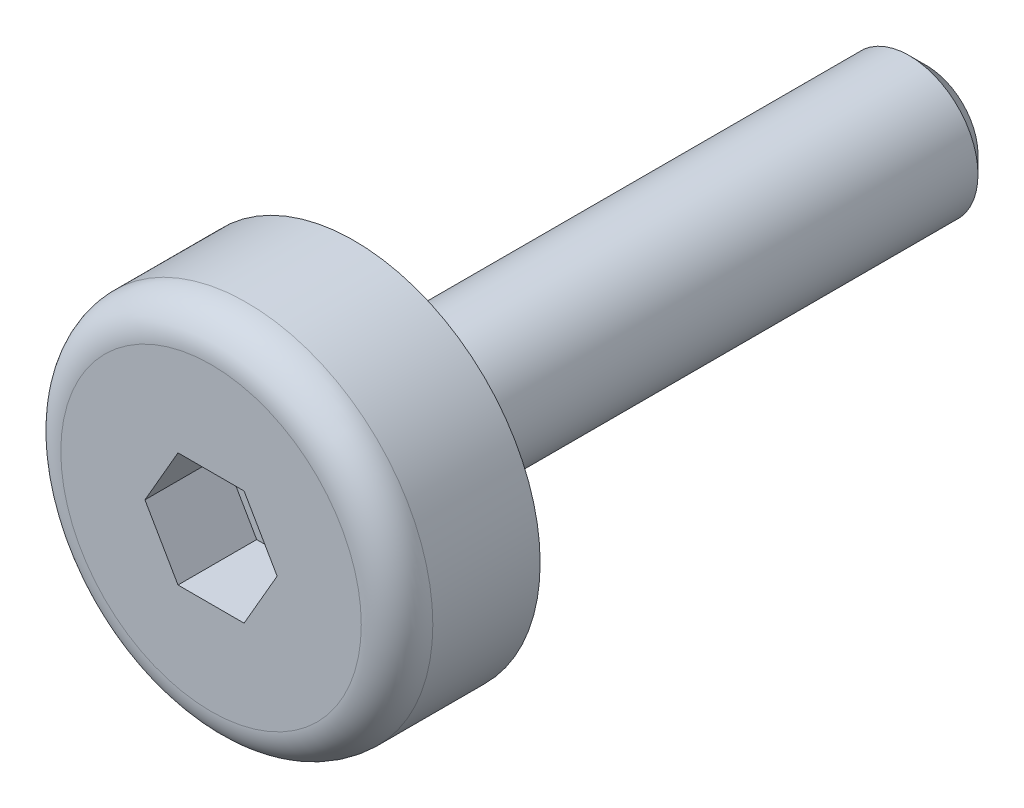
ISO-10303-21;
HEADER;
FILE_DESCRIPTION(('STEP AP214'),'2;1');
FILE_NAME('part.step','',(''),(''),'','','');
FILE_SCHEMA(('AUTOMOTIVE_DESIGN { 1 0 10303 214 1 1 1 1 }'));
ENDSEC;
DATA;
#1=APPLICATION_CONTEXT('core data for automotive mechanical design processes');
#2=APPLICATION_PROTOCOL_DEFINITION('international standard','automotive_design',2000,#1);
#3=PRODUCT_CONTEXT('',#1,'mechanical');
#4=PRODUCT('Part','Part','',(#3));
#5=PRODUCT_RELATED_PRODUCT_CATEGORY('part','',(#4));
#6=PRODUCT_DEFINITION_FORMATION('','',#4);
#7=PRODUCT_DEFINITION_CONTEXT('part definition',#1,'design');
#8=PRODUCT_DEFINITION('design','',#6,#7);
#9=PRODUCT_DEFINITION_SHAPE('','',#8);
#10=(LENGTH_UNIT() NAMED_UNIT(*) SI_UNIT(.MILLI.,.METRE.));
#11=(NAMED_UNIT(*) PLANE_ANGLE_UNIT() SI_UNIT($,.RADIAN.));
#12=(NAMED_UNIT(*) SI_UNIT($,.STERADIAN.) SOLID_ANGLE_UNIT());
#13=UNCERTAINTY_MEASURE_WITH_UNIT(LENGTH_MEASURE(1.E-05),#10,'distance_accuracy_value','');
#14=(GEOMETRIC_REPRESENTATION_CONTEXT(3) GLOBAL_UNCERTAINTY_ASSIGNED_CONTEXT((#13)) GLOBAL_UNIT_ASSIGNED_CONTEXT((#10,
#11,#12)) REPRESENTATION_CONTEXT('',''));
#15=CARTESIAN_POINT('',(0.,0.,0.));
#16=DIRECTION('',(0.,0.,1.));
#17=DIRECTION('',(1.,0.,0.));
#18=AXIS2_PLACEMENT_3D('',#15,#16,#17);
#19=CARTESIAN_POINT('',(0.,0.,-10.));
#20=DIRECTION('',(0.,0.,-1.));
#21=DIRECTION('',(-1.,0.,0.));
#22=AXIS2_PLACEMENT_3D('',#19,#20,#21);
#23=PLANE('',#22);
#24=CARTESIAN_POINT('',(0.,0.,-10.));
#25=DIRECTION('',(0.,0.,-1.));
#26=DIRECTION('',(-1.,0.,0.));
#27=AXIS2_PLACEMENT_3D('',#24,#25,#26);
#28=CIRCLE('',#27,0.900000000000001);
#29=CARTESIAN_POINT('',(-0.900000000000001,0.,-10.));
#30=VERTEX_POINT('',#29);
#31=EDGE_CURVE('E156',#30,#30,#28,.T.);
#32=ORIENTED_EDGE('',*,*,#31,.T.);
#33=EDGE_LOOP('',(#32));
#34=FACE_BOUND('',#33,.T.);
#35=ADVANCED_FACE('F40',(#34),#23,.T.);
#36=CARTESIAN_POINT('',(0.,0.,10.123));
#37=DIRECTION('',(0.,0.,1.));
#38=DIRECTION('',(1.,0.,0.));
#39=AXIS2_PLACEMENT_3D('',#36,#37,#38);
#40=CYLINDRICAL_SURFACE('',#39,1.2);
#41=CARTESIAN_POINT('',(0.,0.,-9.7));
#42=DIRECTION('',(0.,0.,-1.));
#43=DIRECTION('',(-1.,0.,0.));
#44=AXIS2_PLACEMENT_3D('',#41,#42,#43);
#45=CIRCLE('',#44,1.2);
#46=CARTESIAN_POINT('',(-1.2,0.,-9.7));
#47=VERTEX_POINT('',#46);
#48=EDGE_CURVE('E153',#47,#47,#45,.F.);
#49=ORIENTED_EDGE('',*,*,#48,.T.);
#50=EDGE_LOOP('',(#49));
#51=FACE_BOUND('',#50,.T.);
#52=CARTESIAN_POINT('',(0.,0.,0.));
#53=DIRECTION('',(0.,0.,1.));
#54=DIRECTION('',(1.,0.,0.));
#55=AXIS2_PLACEMENT_3D('',#52,#53,#54);
#56=CIRCLE('',#55,1.2);
#57=CARTESIAN_POINT('',(1.2,0.,0.));
#58=VERTEX_POINT('',#57);
#59=EDGE_CURVE('E150',#58,#58,#56,.T.);
#60=ORIENTED_EDGE('',*,*,#59,.F.);
#61=EDGE_LOOP('',(#60));
#62=FACE_BOUND('',#61,.T.);
#63=ADVANCED_FACE('F176',(#51,#62),#40,.T.);
#64=CARTESIAN_POINT('',(1.2,0.,0.));
#65=DIRECTION('',(0.,0.,-1.));
#66=DIRECTION('',(-1.,0.,0.));
#67=AXIS2_PLACEMENT_3D('',#64,#65,#66);
#68=PLANE('',#67);
#69=ORIENTED_EDGE('',*,*,#59,.T.);
#70=EDGE_LOOP('',(#69));
#71=FACE_BOUND('',#70,.T.);
#72=CARTESIAN_POINT('',(0.,0.,0.));
#73=DIRECTION('',(0.,0.,1.));
#74=DIRECTION('',(1.,0.,0.));
#75=AXIS2_PLACEMENT_3D('',#72,#73,#74);
#76=CIRCLE('',#75,3.25);
#77=CARTESIAN_POINT('',(3.25,0.,0.));
#78=VERTEX_POINT('',#77);
#79=EDGE_CURVE('E142',#78,#78,#76,.T.);
#80=ORIENTED_EDGE('',*,*,#79,.F.);
#81=EDGE_LOOP('',(#80));
#82=FACE_BOUND('',#81,.T.);
#83=ADVANCED_FACE('F182',(#71,#82),#68,.T.);
#84=CARTESIAN_POINT('',(0.,0.,10.123));
#85=DIRECTION('',(0.,0.,1.));
#86=DIRECTION('',(1.,0.,0.));
#87=AXIS2_PLACEMENT_3D('',#84,#85,#86);
#88=CYLINDRICAL_SURFACE('',#87,3.25);
#89=CARTESIAN_POINT('',(0.,0.,1.875));
#90=DIRECTION('',(0.,0.,1.));
#91=DIRECTION('',(1.,0.,0.));
#92=AXIS2_PLACEMENT_3D('',#89,#90,#91);
#93=CIRCLE('',#92,3.25);
#94=CARTESIAN_POINT('',(3.25,0.,1.875));
#95=VERTEX_POINT('',#94);
#96=EDGE_CURVE('E11',#95,#95,#93,.F.);
#97=ORIENTED_EDGE('',*,*,#96,.T.);
#98=EDGE_LOOP('',(#97));
#99=FACE_BOUND('',#98,.T.);
#100=ORIENTED_EDGE('',*,*,#79,.T.);
#101=EDGE_LOOP('',(#100));
#102=FACE_BOUND('',#101,.T.);
#103=ADVANCED_FACE('F191',(#99,#102),#88,.T.);
#104=CARTESIAN_POINT('',(3.25,0.,2.5));
#105=DIRECTION('',(0.,0.,1.));
#106=DIRECTION('',(1.,0.,0.));
#107=AXIS2_PLACEMENT_3D('',#104,#105,#106);
#108=PLANE('',#107);
#109=DIRECTION('',(0.499999999999995,0.866025403784441,0.));
#110=VECTOR('',#109,1.);
#111=CARTESIAN_POINT('',(0.577350269189637,-0.999999999999993,2.5));
#112=LINE('',#111,#110);
#113=CARTESIAN_POINT('',(0.577350269189637,-0.999999999999993,2.5));
#114=VERTEX_POINT('',#113);
#115=CARTESIAN_POINT('',(1.15470053837925,0.,2.5));
#116=VERTEX_POINT('',#115);
#117=EDGE_CURVE('E55',#114,#116,#112,.T.);
#118=ORIENTED_EDGE('',*,*,#117,.F.);
#119=DIRECTION('',(1.,0.,0.));
#120=VECTOR('',#119,1.);
#121=CARTESIAN_POINT('',(-0.577350269189617,-1.00000000000001,2.5));
#122=LINE('',#121,#120);
#123=CARTESIAN_POINT('',(-0.577350269189617,-1.00000000000001,2.5));
#124=VERTEX_POINT('',#123);
#125=EDGE_CURVE('E138',#124,#114,#122,.T.);
#126=ORIENTED_EDGE('',*,*,#125,.F.);
#127=DIRECTION('',(0.500000000000007,-0.866025403784434,0.));
#128=VECTOR('',#127,1.);
#129=CARTESIAN_POINT('',(-1.15470053837925,0.,2.5));
#130=LINE('',#129,#128);
#131=CARTESIAN_POINT('',(-1.15470053837925,0.,2.5));
#132=VERTEX_POINT('',#131);
#133=EDGE_CURVE('E136',#132,#124,#130,.T.);
#134=ORIENTED_EDGE('',*,*,#133,.F.);
#135=DIRECTION('',(-0.499999999999995,-0.866025403784442,0.));
#136=VECTOR('',#135,1.);
#137=CARTESIAN_POINT('',(-0.57735026918963,0.999999999999998,2.5));
#138=LINE('',#137,#136);
#139=CARTESIAN_POINT('',(-0.57735026918963,0.999999999999998,2.5));
#140=VERTEX_POINT('',#139);
#141=EDGE_CURVE('E103',#140,#132,#138,.T.);
#142=ORIENTED_EDGE('',*,*,#141,.F.);
#143=DIRECTION('',(-1.,0.,0.));
#144=VECTOR('',#143,1.);
#145=CARTESIAN_POINT('',(0.577350269189624,1.,2.5));
#146=LINE('',#145,#144);
#147=CARTESIAN_POINT('',(0.577350269189624,1.,2.5));
#148=VERTEX_POINT('',#147);
#149=EDGE_CURVE('E132',#148,#140,#146,.T.);
#150=ORIENTED_EDGE('',*,*,#149,.F.);
#151=DIRECTION('',(-0.500000000000001,0.866025403784438,0.));
#152=VECTOR('',#151,1.);
#153=CARTESIAN_POINT('',(1.15470053837925,0.,2.5));
#154=LINE('',#153,#152);
#155=EDGE_CURVE('E129',#116,#148,#154,.T.);
#156=ORIENTED_EDGE('',*,*,#155,.F.);
#157=EDGE_LOOP('',(#118,#126,#134,#142,#150,#156));
#158=FACE_BOUND('',#157,.T.);
#159=CARTESIAN_POINT('',(0.,0.,2.5));
#160=DIRECTION('',(0.,0.,1.));
#161=DIRECTION('',(1.,0.,0.));
#162=AXIS2_PLACEMENT_3D('',#159,#160,#161);
#163=CIRCLE('',#162,2.625);
#164=CARTESIAN_POINT('',(2.625,0.,2.5));
#165=VERTEX_POINT('',#164);
#166=EDGE_CURVE('E48',#165,#165,#163,.T.);
#167=ORIENTED_EDGE('',*,*,#166,.T.);
#168=EDGE_LOOP('',(#167));
#169=FACE_BOUND('',#168,.T.);
#170=ADVANCED_FACE('F161',(#158,#169),#108,.T.);
#171=CARTESIAN_POINT('',(0.,0.,-9.7));
#172=DIRECTION('',(0.,0.,1.));
#173=DIRECTION('',(1.,0.,0.));
#174=AXIS2_PLACEMENT_3D('',#171,#172,#173);
#175=CONICAL_SURFACE('',#174,1.2,0.785398163397446);
#176=ORIENTED_EDGE('',*,*,#31,.F.);
#177=EDGE_LOOP('',(#176));
#178=FACE_BOUND('',#177,.T.);
#179=ORIENTED_EDGE('',*,*,#48,.F.);
#180=EDGE_LOOP('',(#179));
#181=FACE_BOUND('',#180,.T.);
#182=ADVANCED_FACE('F165',(#178,#181),#175,.T.);
#183=CARTESIAN_POINT('',(0.,0.,1.875));
#184=DIRECTION('',(0.,0.,1.));
#185=DIRECTION('',(1.,0.,0.));
#186=AXIS2_PLACEMENT_3D('',#183,#184,#185);
#187=TOROIDAL_SURFACE('',#186,2.625,0.625);
#188=ORIENTED_EDGE('',*,*,#96,.F.);
#189=EDGE_LOOP('',(#188));
#190=FACE_BOUND('',#189,.T.);
#191=ORIENTED_EDGE('',*,*,#166,.F.);
#192=EDGE_LOOP('',(#191));
#193=FACE_BOUND('',#192,.T.);
#194=ADVANCED_FACE('F42',(#190,#193),#187,.T.);
#195=CARTESIAN_POINT('',(0.577350269189637,-0.999999999999993,1.125));
#196=DIRECTION('',(0.866025403784441,-0.499999999999995,0.));
#197=DIRECTION('',(0.499999999999995,0.866025403784441,0.));
#198=AXIS2_PLACEMENT_3D('',#195,#196,#197);
#199=PLANE('',#198);
#200=ORIENTED_EDGE('',*,*,#117,.T.);
#201=DIRECTION('',(0.,0.,1.));
#202=VECTOR('',#201,1.);
#203=CARTESIAN_POINT('',(1.15470053837925,0.,1.125));
#204=LINE('',#203,#202);
#205=CARTESIAN_POINT('',(1.15470053837925,0.,1.125));
#206=VERTEX_POINT('',#205);
#207=EDGE_CURVE('E85',#206,#116,#204,.T.);
#208=ORIENTED_EDGE('',*,*,#207,.F.);
#209=DIRECTION('',(0.499999999999995,0.866025403784441,0.));
#210=VECTOR('',#209,1.);
#211=CARTESIAN_POINT('',(0.577350269189637,-0.999999999999993,1.125));
#212=LINE('',#211,#210);
#213=CARTESIAN_POINT('',(0.577350269189637,-0.999999999999993,1.125));
#214=VERTEX_POINT('',#213);
#215=EDGE_CURVE('E140',#214,#206,#212,.T.);
#216=ORIENTED_EDGE('',*,*,#215,.F.);
#217=DIRECTION('',(0.,0.,1.));
#218=VECTOR('',#217,1.);
#219=CARTESIAN_POINT('',(0.577350269189637,-0.999999999999993,1.125));
#220=LINE('',#219,#218);
#221=EDGE_CURVE('E63',#214,#114,#220,.T.);
#222=ORIENTED_EDGE('',*,*,#221,.T.);
#223=EDGE_LOOP('',(#200,#208,#216,#222));
#224=FACE_BOUND('',#223,.T.);
#225=ADVANCED_FACE('F164',(#224),#199,.F.);
#226=CARTESIAN_POINT('',(-0.577350269189617,-1.00000000000001,1.125));
#227=DIRECTION('',(0.,-1.,0.));
#228=DIRECTION('',(1.,0.,0.));
#229=AXIS2_PLACEMENT_3D('',#226,#227,#228);
#230=PLANE('',#229);
#231=ORIENTED_EDGE('',*,*,#125,.T.);
#232=ORIENTED_EDGE('',*,*,#221,.F.);
#233=DIRECTION('',(1.,0.,0.));
#234=VECTOR('',#233,1.);
#235=CARTESIAN_POINT('',(-0.577350269189617,-1.00000000000001,1.125));
#236=LINE('',#235,#234);
#237=CARTESIAN_POINT('',(-0.577350269189617,-1.00000000000001,1.125));
#238=VERTEX_POINT('',#237);
#239=EDGE_CURVE('E115',#238,#214,#236,.T.);
#240=ORIENTED_EDGE('',*,*,#239,.F.);
#241=DIRECTION('',(0.,0.,1.));
#242=VECTOR('',#241,1.);
#243=CARTESIAN_POINT('',(-0.577350269189617,-1.00000000000001,1.125));
#244=LINE('',#243,#242);
#245=EDGE_CURVE('E107',#238,#124,#244,.T.);
#246=ORIENTED_EDGE('',*,*,#245,.T.);
#247=EDGE_LOOP('',(#231,#232,#240,#246));
#248=FACE_BOUND('',#247,.T.);
#249=ADVANCED_FACE('F171',(#248),#230,.F.);
#250=CARTESIAN_POINT('',(-1.15470053837925,0.,1.125));
#251=DIRECTION('',(-0.866025403784435,-0.500000000000007,0.));
#252=DIRECTION('',(0.500000000000007,-0.866025403784435,0.));
#253=AXIS2_PLACEMENT_3D('',#250,#251,#252);
#254=PLANE('',#253);
#255=ORIENTED_EDGE('',*,*,#133,.T.);
#256=ORIENTED_EDGE('',*,*,#245,.F.);
#257=DIRECTION('',(0.500000000000007,-0.866025403784434,0.));
#258=VECTOR('',#257,1.);
#259=CARTESIAN_POINT('',(-1.15470053837925,0.,1.125));
#260=LINE('',#259,#258);
#261=CARTESIAN_POINT('',(-1.15470053837925,0.,1.125));
#262=VERTEX_POINT('',#261);
#263=EDGE_CURVE('E111',#262,#238,#260,.T.);
#264=ORIENTED_EDGE('',*,*,#263,.F.);
#265=DIRECTION('',(0.,0.,1.));
#266=VECTOR('',#265,1.);
#267=CARTESIAN_POINT('',(-1.15470053837925,0.,1.125));
#268=LINE('',#267,#266);
#269=EDGE_CURVE('E96',#262,#132,#268,.T.);
#270=ORIENTED_EDGE('',*,*,#269,.T.);
#271=EDGE_LOOP('',(#255,#256,#264,#270));
#272=FACE_BOUND('',#271,.T.);
#273=ADVANCED_FACE('F112',(#272),#254,.F.);
#274=CARTESIAN_POINT('',(-0.57735026918963,0.999999999999998,1.125));
#275=DIRECTION('',(-0.866025403784442,0.499999999999995,0.));
#276=DIRECTION('',(-0.499999999999995,-0.866025403784441,0.));
#277=AXIS2_PLACEMENT_3D('',#274,#275,#276);
#278=PLANE('',#277);
#279=ORIENTED_EDGE('',*,*,#141,.T.);
#280=ORIENTED_EDGE('',*,*,#269,.F.);
#281=DIRECTION('',(-0.499999999999995,-0.866025403784442,0.));
#282=VECTOR('',#281,1.);
#283=CARTESIAN_POINT('',(-0.57735026918963,0.999999999999998,1.125));
#284=LINE('',#283,#282);
#285=CARTESIAN_POINT('',(-0.57735026918963,0.999999999999998,1.125));
#286=VERTEX_POINT('',#285);
#287=EDGE_CURVE('E100',#286,#262,#284,.T.);
#288=ORIENTED_EDGE('',*,*,#287,.F.);
#289=DIRECTION('',(0.,0.,1.));
#290=VECTOR('',#289,1.);
#291=CARTESIAN_POINT('',(-0.57735026918963,0.999999999999998,1.125));
#292=LINE('',#291,#290);
#293=EDGE_CURVE('E108',#286,#140,#292,.T.);
#294=ORIENTED_EDGE('',*,*,#293,.T.);
#295=EDGE_LOOP('',(#279,#280,#288,#294));
#296=FACE_BOUND('',#295,.T.);
#297=ADVANCED_FACE('F98',(#296),#278,.F.);
#298=CARTESIAN_POINT('',(0.577350269189624,1.,1.125));
#299=DIRECTION('',(0.,1.,0.));
#300=DIRECTION('',(-1.,0.,0.));
#301=AXIS2_PLACEMENT_3D('',#298,#299,#300);
#302=PLANE('',#301);
#303=ORIENTED_EDGE('',*,*,#149,.T.);
#304=ORIENTED_EDGE('',*,*,#293,.F.);
#305=DIRECTION('',(-1.,0.,0.));
#306=VECTOR('',#305,1.);
#307=CARTESIAN_POINT('',(0.577350269189624,1.,1.125));
#308=LINE('',#307,#306);
#309=CARTESIAN_POINT('',(0.577350269189624,1.,1.125));
#310=VERTEX_POINT('',#309);
#311=EDGE_CURVE('E121',#310,#286,#308,.T.);
#312=ORIENTED_EDGE('',*,*,#311,.F.);
#313=DIRECTION('',(0.,0.,1.));
#314=VECTOR('',#313,1.);
#315=CARTESIAN_POINT('',(0.577350269189624,1.,1.125));
#316=LINE('',#315,#314);
#317=EDGE_CURVE('E145',#310,#148,#316,.T.);
#318=ORIENTED_EDGE('',*,*,#317,.T.);
#319=EDGE_LOOP('',(#303,#304,#312,#318));
#320=FACE_BOUND('',#319,.T.);
#321=ADVANCED_FACE('F202',(#320),#302,.F.);
#322=CARTESIAN_POINT('',(1.15470053837925,0.,1.125));
#323=DIRECTION('',(0.866025403784438,0.500000000000001,0.));
#324=DIRECTION('',(-0.500000000000001,0.866025403784438,0.));
#325=AXIS2_PLACEMENT_3D('',#322,#323,#324);
#326=PLANE('',#325);
#327=ORIENTED_EDGE('',*,*,#155,.T.);
#328=ORIENTED_EDGE('',*,*,#317,.F.);
#329=DIRECTION('',(-0.500000000000001,0.866025403784438,0.));
#330=VECTOR('',#329,1.);
#331=CARTESIAN_POINT('',(1.15470053837925,0.,1.125));
#332=LINE('',#331,#330);
#333=EDGE_CURVE('E123',#206,#310,#332,.T.);
#334=ORIENTED_EDGE('',*,*,#333,.F.);
#335=ORIENTED_EDGE('',*,*,#207,.T.);
#336=EDGE_LOOP('',(#327,#328,#334,#335));
#337=FACE_BOUND('',#336,.T.);
#338=ADVANCED_FACE('F199',(#337),#326,.F.);
#339=CARTESIAN_POINT('',(0.,0.,1.125));
#340=DIRECTION('',(0.,0.,1.));
#341=DIRECTION('',(1.,0.,0.));
#342=AXIS2_PLACEMENT_3D('',#339,#340,#341);
#343=PLANE('',#342);
#344=ORIENTED_EDGE('',*,*,#215,.T.);
#345=ORIENTED_EDGE('',*,*,#333,.T.);
#346=ORIENTED_EDGE('',*,*,#311,.T.);
#347=ORIENTED_EDGE('',*,*,#287,.T.);
#348=ORIENTED_EDGE('',*,*,#263,.T.);
#349=ORIENTED_EDGE('',*,*,#239,.T.);
#350=EDGE_LOOP('',(#344,#345,#346,#347,#348,#349));
#351=FACE_BOUND('',#350,.T.);
#352=ADVANCED_FACE('F118',(#351),#343,.T.);
#353=CLOSED_SHELL('',(#35,#63,#83,#103,#170,#182,#194,#225,#249,#273,#297,#321,#338,#352));
#354=MANIFOLD_SOLID_BREP('B2',#353);
#355=ADVANCED_BREP_SHAPE_REPRESENTATION('',(#18,#354),#14);
#356=SHAPE_DEFINITION_REPRESENTATION(#9,#355);
ENDSEC;
END-ISO-10303-21;
